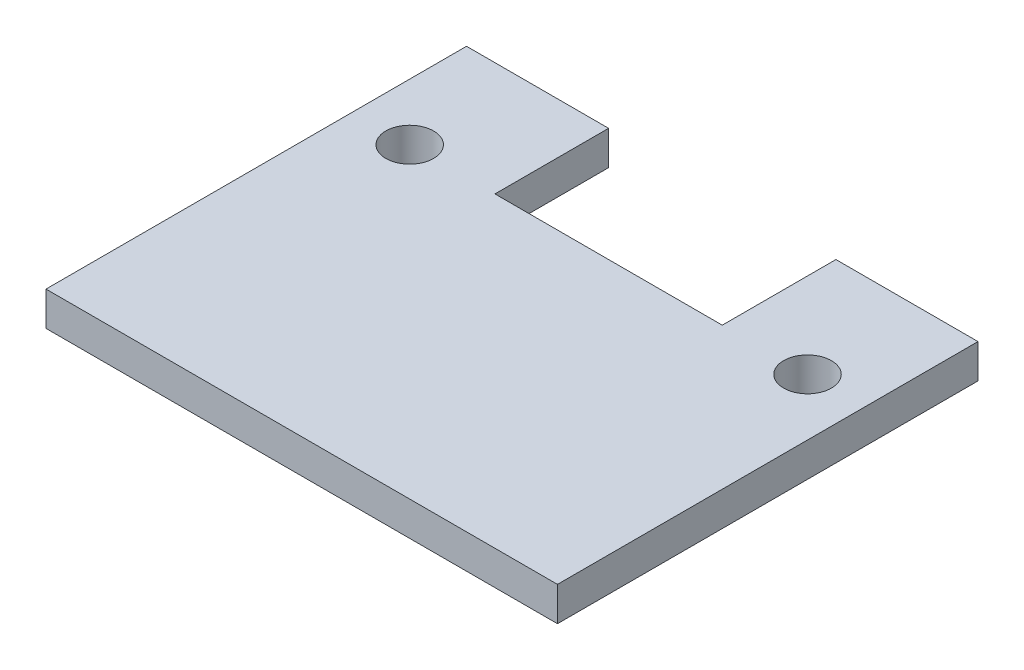
ISO-10303-21;
HEADER;
FILE_DESCRIPTION(('STEP AP214'),'2;1');
FILE_NAME('part.step','',(''),(''),'','','');
FILE_SCHEMA(('AUTOMOTIVE_DESIGN { 1 0 10303 214 1 1 1 1 }'));
ENDSEC;
DATA;
#1=APPLICATION_CONTEXT('core data for automotive mechanical design processes');
#2=APPLICATION_PROTOCOL_DEFINITION('international standard','automotive_design',2000,#1);
#3=PRODUCT_CONTEXT('',#1,'mechanical');
#4=PRODUCT('Part','Part','',(#3));
#5=PRODUCT_RELATED_PRODUCT_CATEGORY('part','',(#4));
#6=PRODUCT_DEFINITION_FORMATION('','',#4);
#7=PRODUCT_DEFINITION_CONTEXT('part definition',#1,'design');
#8=PRODUCT_DEFINITION('design','',#6,#7);
#9=PRODUCT_DEFINITION_SHAPE('','',#8);
#10=(LENGTH_UNIT() NAMED_UNIT(*) SI_UNIT(.MILLI.,.METRE.));
#11=(NAMED_UNIT(*) PLANE_ANGLE_UNIT() SI_UNIT($,.RADIAN.));
#12=(NAMED_UNIT(*) SI_UNIT($,.STERADIAN.) SOLID_ANGLE_UNIT());
#13=UNCERTAINTY_MEASURE_WITH_UNIT(LENGTH_MEASURE(1.E-05),#10,'distance_accuracy_value','');
#14=(GEOMETRIC_REPRESENTATION_CONTEXT(3) GLOBAL_UNCERTAINTY_ASSIGNED_CONTEXT((#13)) GLOBAL_UNIT_ASSIGNED_CONTEXT((#10,
#11,#12)) REPRESENTATION_CONTEXT('',''));
#15=CARTESIAN_POINT('',(0.,0.,0.));
#16=DIRECTION('',(0.,0.,1.));
#17=DIRECTION('',(1.,0.,0.));
#18=AXIS2_PLACEMENT_3D('',#15,#16,#17);
#19=CARTESIAN_POINT('',(0.,3.,-18.5));
#20=DIRECTION('',(0.,0.,-1.));
#21=DIRECTION('',(-1.,0.,0.));
#22=AXIS2_PLACEMENT_3D('',#19,#20,#21);
#23=PLANE('',#22);
#24=DIRECTION('',(1.,0.,0.));
#25=VECTOR('',#24,1.);
#26=CARTESIAN_POINT('',(0.,0.,-18.5));
#27=LINE('',#26,#25);
#28=CARTESIAN_POINT('',(10.,0.,-18.5));
#29=VERTEX_POINT('',#28);
#30=CARTESIAN_POINT('',(22.5,0.,-18.5));
#31=VERTEX_POINT('',#30);
#32=EDGE_CURVE('E142',#29,#31,#27,.T.);
#33=ORIENTED_EDGE('',*,*,#32,.F.);
#34=DIRECTION('',(0.,-1.,0.));
#35=VECTOR('',#34,1.);
#36=CARTESIAN_POINT('',(10.,3.,-18.5));
#37=LINE('',#36,#35);
#38=CARTESIAN_POINT('',(10.,3.,-18.5));
#39=VERTEX_POINT('',#38);
#40=EDGE_CURVE('E11',#39,#29,#37,.T.);
#41=ORIENTED_EDGE('',*,*,#40,.F.);
#42=DIRECTION('',(1.,0.,0.));
#43=VECTOR('',#42,1.);
#44=CARTESIAN_POINT('',(0.,3.,-18.5));
#45=LINE('',#44,#43);
#46=CARTESIAN_POINT('',(22.5,3.,-18.5));
#47=VERTEX_POINT('',#46);
#48=EDGE_CURVE('E131',#39,#47,#45,.T.);
#49=ORIENTED_EDGE('',*,*,#48,.T.);
#50=DIRECTION('',(0.,-1.,0.));
#51=VECTOR('',#50,1.);
#52=CARTESIAN_POINT('',(22.5,3.,-18.5));
#53=LINE('',#52,#51);
#54=EDGE_CURVE('E87',#47,#31,#53,.T.);
#55=ORIENTED_EDGE('',*,*,#54,.T.);
#56=EDGE_LOOP('',(#33,#41,#49,#55));
#57=FACE_BOUND('',#56,.T.);
#58=ADVANCED_FACE('F35',(#57),#23,.T.);
#59=CARTESIAN_POINT('',(10.,3.,0.));
#60=DIRECTION('',(1.,0.,0.));
#61=DIRECTION('',(0.,0.,-1.));
#62=AXIS2_PLACEMENT_3D('',#59,#60,#61);
#63=PLANE('',#62);
#64=DIRECTION('',(0.,0.,1.));
#65=VECTOR('',#64,1.);
#66=CARTESIAN_POINT('',(10.,0.,0.));
#67=LINE('',#66,#65);
#68=CARTESIAN_POINT('',(10.,0.,-8.5));
#69=VERTEX_POINT('',#68);
#70=EDGE_CURVE('E144',#29,#69,#67,.T.);
#71=ORIENTED_EDGE('',*,*,#70,.T.);
#72=DIRECTION('',(0.,-1.,0.));
#73=VECTOR('',#72,1.);
#74=CARTESIAN_POINT('',(10.,3.,-8.5));
#75=LINE('',#74,#73);
#76=CARTESIAN_POINT('',(10.,3.,-8.5));
#77=VERTEX_POINT('',#76);
#78=EDGE_CURVE('E44',#77,#69,#75,.T.);
#79=ORIENTED_EDGE('',*,*,#78,.F.);
#80=DIRECTION('',(0.,0.,1.));
#81=VECTOR('',#80,1.);
#82=CARTESIAN_POINT('',(10.,3.,0.));
#83=LINE('',#82,#81);
#84=EDGE_CURVE('E182',#39,#77,#83,.T.);
#85=ORIENTED_EDGE('',*,*,#84,.F.);
#86=ORIENTED_EDGE('',*,*,#40,.T.);
#87=EDGE_LOOP('',(#71,#79,#85,#86));
#88=FACE_BOUND('',#87,.T.);
#89=ADVANCED_FACE('F174',(#88),#63,.F.);
#90=CARTESIAN_POINT('',(0.,3.,-8.5));
#91=DIRECTION('',(0.,0.,-1.));
#92=DIRECTION('',(-1.,0.,0.));
#93=AXIS2_PLACEMENT_3D('',#90,#91,#92);
#94=PLANE('',#93);
#95=DIRECTION('',(1.,0.,0.));
#96=VECTOR('',#95,1.);
#97=CARTESIAN_POINT('',(0.,0.,-8.5));
#98=LINE('',#97,#96);
#99=CARTESIAN_POINT('',(-9.99999999999999,0.,-8.5));
#100=VERTEX_POINT('',#99);
#101=EDGE_CURVE('E148',#100,#69,#98,.T.);
#102=ORIENTED_EDGE('',*,*,#101,.F.);
#103=DIRECTION('',(0.,-1.,0.));
#104=VECTOR('',#103,1.);
#105=CARTESIAN_POINT('',(-9.99999999999999,3.,-8.5));
#106=LINE('',#105,#104);
#107=CARTESIAN_POINT('',(-9.99999999999999,3.,-8.5));
#108=VERTEX_POINT('',#107);
#109=EDGE_CURVE('E164',#108,#100,#106,.T.);
#110=ORIENTED_EDGE('',*,*,#109,.F.);
#111=DIRECTION('',(1.,0.,0.));
#112=VECTOR('',#111,1.);
#113=CARTESIAN_POINT('',(0.,3.,-8.5));
#114=LINE('',#113,#112);
#115=EDGE_CURVE('E171',#108,#77,#114,.T.);
#116=ORIENTED_EDGE('',*,*,#115,.T.);
#117=ORIENTED_EDGE('',*,*,#78,.T.);
#118=EDGE_LOOP('',(#102,#110,#116,#117));
#119=FACE_BOUND('',#118,.T.);
#120=ADVANCED_FACE('F169',(#119),#94,.T.);
#121=CARTESIAN_POINT('',(-9.99999999999999,3.,0.));
#122=DIRECTION('',(1.,0.,0.));
#123=DIRECTION('',(0.,0.,-1.));
#124=AXIS2_PLACEMENT_3D('',#121,#122,#123);
#125=PLANE('',#124);
#126=DIRECTION('',(0.,0.,1.));
#127=VECTOR('',#126,1.);
#128=CARTESIAN_POINT('',(-9.99999999999999,0.,0.));
#129=LINE('',#128,#127);
#130=CARTESIAN_POINT('',(-10.,0.,-18.5));
#131=VERTEX_POINT('',#130);
#132=EDGE_CURVE('E151',#131,#100,#129,.T.);
#133=ORIENTED_EDGE('',*,*,#132,.F.);
#134=DIRECTION('',(0.,-1.,0.));
#135=VECTOR('',#134,1.);
#136=CARTESIAN_POINT('',(-10.,3.,-18.5));
#137=LINE('',#136,#135);
#138=CARTESIAN_POINT('',(-10.,3.,-18.5));
#139=VERTEX_POINT('',#138);
#140=EDGE_CURVE('E162',#139,#131,#137,.T.);
#141=ORIENTED_EDGE('',*,*,#140,.F.);
#142=DIRECTION('',(0.,0.,1.));
#143=VECTOR('',#142,1.);
#144=CARTESIAN_POINT('',(-9.99999999999999,3.,0.));
#145=LINE('',#144,#143);
#146=EDGE_CURVE('E129',#139,#108,#145,.T.);
#147=ORIENTED_EDGE('',*,*,#146,.T.);
#148=ORIENTED_EDGE('',*,*,#109,.T.);
#149=EDGE_LOOP('',(#133,#141,#147,#148));
#150=FACE_BOUND('',#149,.T.);
#151=ADVANCED_FACE('F180',(#150),#125,.T.);
#152=CARTESIAN_POINT('',(-22.5,0.,-18.5));
#153=VERTEX_POINT('',#152);
#154=EDGE_CURVE('E145',#153,#131,#27,.T.);
#155=ORIENTED_EDGE('',*,*,#154,.F.);
#156=DIRECTION('',(0.,-1.,0.));
#157=VECTOR('',#156,1.);
#158=CARTESIAN_POINT('',(-22.5,3.,-18.5));
#159=LINE('',#158,#157);
#160=CARTESIAN_POINT('',(-22.5,3.,-18.5));
#161=VERTEX_POINT('',#160);
#162=EDGE_CURVE('E116',#161,#153,#159,.T.);
#163=ORIENTED_EDGE('',*,*,#162,.F.);
#164=EDGE_CURVE('E127',#161,#139,#45,.T.);
#165=ORIENTED_EDGE('',*,*,#164,.T.);
#166=ORIENTED_EDGE('',*,*,#140,.T.);
#167=EDGE_LOOP('',(#155,#163,#165,#166));
#168=FACE_BOUND('',#167,.T.);
#169=ADVANCED_FACE('F212',(#168),#23,.T.);
#170=CARTESIAN_POINT('',(-22.5,3.,0.));
#171=DIRECTION('',(-1.,0.,0.));
#172=DIRECTION('',(0.,0.,1.));
#173=AXIS2_PLACEMENT_3D('',#170,#171,#172);
#174=PLANE('',#173);
#175=DIRECTION('',(0.,0.,-1.));
#176=VECTOR('',#175,1.);
#177=CARTESIAN_POINT('',(-22.5,0.,0.));
#178=LINE('',#177,#176);
#179=CARTESIAN_POINT('',(-22.5,0.,18.5));
#180=VERTEX_POINT('',#179);
#181=EDGE_CURVE('E113',#180,#153,#178,.T.);
#182=ORIENTED_EDGE('',*,*,#181,.F.);
#183=DIRECTION('',(0.,-1.,0.));
#184=VECTOR('',#183,1.);
#185=CARTESIAN_POINT('',(-22.5,3.,18.5));
#186=LINE('',#185,#184);
#187=CARTESIAN_POINT('',(-22.5,3.,18.5));
#188=VERTEX_POINT('',#187);
#189=EDGE_CURVE('E107',#188,#180,#186,.T.);
#190=ORIENTED_EDGE('',*,*,#189,.F.);
#191=DIRECTION('',(0.,0.,-1.));
#192=VECTOR('',#191,1.);
#193=CARTESIAN_POINT('',(-22.5,3.,0.));
#194=LINE('',#193,#192);
#195=EDGE_CURVE('E111',#188,#161,#194,.T.);
#196=ORIENTED_EDGE('',*,*,#195,.T.);
#197=ORIENTED_EDGE('',*,*,#162,.T.);
#198=EDGE_LOOP('',(#182,#190,#196,#197));
#199=FACE_BOUND('',#198,.T.);
#200=ADVANCED_FACE('F109',(#199),#174,.T.);
#201=CARTESIAN_POINT('',(0.,3.,18.5));
#202=DIRECTION('',(0.,0.,-1.));
#203=DIRECTION('',(-1.,0.,0.));
#204=AXIS2_PLACEMENT_3D('',#201,#202,#203);
#205=PLANE('',#204);
#206=DIRECTION('',(1.,0.,0.));
#207=VECTOR('',#206,1.);
#208=CARTESIAN_POINT('',(0.,0.,18.5));
#209=LINE('',#208,#207);
#210=CARTESIAN_POINT('',(22.5,0.,18.5));
#211=VERTEX_POINT('',#210);
#212=EDGE_CURVE('E155',#180,#211,#209,.T.);
#213=ORIENTED_EDGE('',*,*,#212,.T.);
#214=DIRECTION('',(0.,-1.,0.));
#215=VECTOR('',#214,1.);
#216=CARTESIAN_POINT('',(22.5,3.,18.5));
#217=LINE('',#216,#215);
#218=CARTESIAN_POINT('',(22.5,3.,18.5));
#219=VERTEX_POINT('',#218);
#220=EDGE_CURVE('E117',#219,#211,#217,.T.);
#221=ORIENTED_EDGE('',*,*,#220,.F.);
#222=DIRECTION('',(1.,0.,0.));
#223=VECTOR('',#222,1.);
#224=CARTESIAN_POINT('',(0.,3.,18.5));
#225=LINE('',#224,#223);
#226=EDGE_CURVE('E120',#188,#219,#225,.T.);
#227=ORIENTED_EDGE('',*,*,#226,.F.);
#228=ORIENTED_EDGE('',*,*,#189,.T.);
#229=EDGE_LOOP('',(#213,#221,#227,#228));
#230=FACE_BOUND('',#229,.T.);
#231=ADVANCED_FACE('F121',(#230),#205,.F.);
#232=CARTESIAN_POINT('',(-17.5,3.,-8.50000000000001));
#233=DIRECTION('',(0.,-1.,0.));
#234=DIRECTION('',(0.,0.,-1.));
#235=AXIS2_PLACEMENT_3D('',#232,#233,#234);
#236=CYLINDRICAL_SURFACE('',#235,2.1);
#237=CARTESIAN_POINT('',(-17.5,3.,-8.50000000000001));
#238=DIRECTION('',(0.,1.,0.));
#239=DIRECTION('',(0.,0.,1.));
#240=AXIS2_PLACEMENT_3D('',#237,#238,#239);
#241=CIRCLE('',#240,2.1);
#242=CARTESIAN_POINT('',(-17.5,3.,-6.4));
#243=VERTEX_POINT('',#242);
#244=EDGE_CURVE('E185',#243,#243,#241,.T.);
#245=ORIENTED_EDGE('',*,*,#244,.T.);
#246=EDGE_LOOP('',(#245));
#247=FACE_BOUND('',#246,.T.);
#248=CARTESIAN_POINT('',(-17.5,0.,-8.50000000000001));
#249=DIRECTION('',(0.,1.,0.));
#250=DIRECTION('',(0.,0.,1.));
#251=AXIS2_PLACEMENT_3D('',#248,#249,#250);
#252=CIRCLE('',#251,2.1);
#253=CARTESIAN_POINT('',(-17.5,0.,-6.4));
#254=VERTEX_POINT('',#253);
#255=EDGE_CURVE('E139',#254,#254,#252,.T.);
#256=ORIENTED_EDGE('',*,*,#255,.F.);
#257=EDGE_LOOP('',(#256));
#258=FACE_BOUND('',#257,.T.);
#259=ADVANCED_FACE('F199',(#247,#258),#236,.F.);
#260=CARTESIAN_POINT('',(17.5,3.,-8.5));
#261=DIRECTION('',(0.,-1.,0.));
#262=DIRECTION('',(0.,0.,-1.));
#263=AXIS2_PLACEMENT_3D('',#260,#261,#262);
#264=CYLINDRICAL_SURFACE('',#263,2.1);
#265=CARTESIAN_POINT('',(17.5,3.,-8.5));
#266=DIRECTION('',(0.,1.,0.));
#267=DIRECTION('',(0.,0.,1.));
#268=AXIS2_PLACEMENT_3D('',#265,#266,#267);
#269=CIRCLE('',#268,2.1);
#270=CARTESIAN_POINT('',(17.5,3.,-6.4));
#271=VERTEX_POINT('',#270);
#272=EDGE_CURVE('E158',#271,#271,#269,.T.);
#273=ORIENTED_EDGE('',*,*,#272,.T.);
#274=EDGE_LOOP('',(#273));
#275=FACE_BOUND('',#274,.T.);
#276=CARTESIAN_POINT('',(17.5,0.,-8.5));
#277=DIRECTION('',(0.,1.,0.));
#278=DIRECTION('',(0.,0.,1.));
#279=AXIS2_PLACEMENT_3D('',#276,#277,#278);
#280=CIRCLE('',#279,2.1);
#281=CARTESIAN_POINT('',(17.5,0.,-6.4));
#282=VERTEX_POINT('',#281);
#283=EDGE_CURVE('E136',#282,#282,#280,.T.);
#284=ORIENTED_EDGE('',*,*,#283,.F.);
#285=EDGE_LOOP('',(#284));
#286=FACE_BOUND('',#285,.T.);
#287=ADVANCED_FACE('F37',(#275,#286),#264,.F.);
#288=CARTESIAN_POINT('',(22.5,3.,0.));
#289=DIRECTION('',(-1.,0.,0.));
#290=DIRECTION('',(0.,0.,1.));
#291=AXIS2_PLACEMENT_3D('',#288,#289,#290);
#292=PLANE('',#291);
#293=DIRECTION('',(0.,0.,-1.));
#294=VECTOR('',#293,1.);
#295=CARTESIAN_POINT('',(22.5,0.,0.));
#296=LINE('',#295,#294);
#297=EDGE_CURVE('E80',#211,#31,#296,.T.);
#298=ORIENTED_EDGE('',*,*,#297,.T.);
#299=ORIENTED_EDGE('',*,*,#54,.F.);
#300=DIRECTION('',(0.,0.,-1.));
#301=VECTOR('',#300,1.);
#302=CARTESIAN_POINT('',(22.5,3.,0.));
#303=LINE('',#302,#301);
#304=EDGE_CURVE('E52',#219,#47,#303,.T.);
#305=ORIENTED_EDGE('',*,*,#304,.F.);
#306=ORIENTED_EDGE('',*,*,#220,.T.);
#307=EDGE_LOOP('',(#298,#299,#305,#306));
#308=FACE_BOUND('',#307,.T.);
#309=ADVANCED_FACE('F195',(#308),#292,.F.);
#310=CARTESIAN_POINT('',(0.,3.,0.));
#311=DIRECTION('',(0.,1.,0.));
#312=DIRECTION('',(0.,0.,1.));
#313=AXIS2_PLACEMENT_3D('',#310,#311,#312);
#314=PLANE('',#313);
#315=ORIENTED_EDGE('',*,*,#272,.F.);
#316=EDGE_LOOP('',(#315));
#317=FACE_BOUND('',#316,.T.);
#318=ORIENTED_EDGE('',*,*,#244,.F.);
#319=EDGE_LOOP('',(#318));
#320=FACE_BOUND('',#319,.T.);
#321=ORIENTED_EDGE('',*,*,#48,.F.);
#322=ORIENTED_EDGE('',*,*,#84,.T.);
#323=ORIENTED_EDGE('',*,*,#115,.F.);
#324=ORIENTED_EDGE('',*,*,#146,.F.);
#325=ORIENTED_EDGE('',*,*,#164,.F.);
#326=ORIENTED_EDGE('',*,*,#195,.F.);
#327=ORIENTED_EDGE('',*,*,#226,.T.);
#328=ORIENTED_EDGE('',*,*,#304,.T.);
#329=EDGE_LOOP('',(#321,#322,#323,#324,#325,#326,#327,#328));
#330=FACE_BOUND('',#329,.T.);
#331=ADVANCED_FACE('F124',(#317,#320,#330),#314,.T.);
#332=CARTESIAN_POINT('',(0.,0.,0.));
#333=DIRECTION('',(0.,1.,0.));
#334=DIRECTION('',(0.,0.,1.));
#335=AXIS2_PLACEMENT_3D('',#332,#333,#334);
#336=PLANE('',#335);
#337=ORIENTED_EDGE('',*,*,#283,.T.);
#338=EDGE_LOOP('',(#337));
#339=FACE_BOUND('',#338,.T.);
#340=ORIENTED_EDGE('',*,*,#255,.T.);
#341=EDGE_LOOP('',(#340));
#342=FACE_BOUND('',#341,.T.);
#343=ORIENTED_EDGE('',*,*,#32,.T.);
#344=ORIENTED_EDGE('',*,*,#297,.F.);
#345=ORIENTED_EDGE('',*,*,#212,.F.);
#346=ORIENTED_EDGE('',*,*,#181,.T.);
#347=ORIENTED_EDGE('',*,*,#154,.T.);
#348=ORIENTED_EDGE('',*,*,#132,.T.);
#349=ORIENTED_EDGE('',*,*,#101,.T.);
#350=ORIENTED_EDGE('',*,*,#70,.F.);
#351=EDGE_LOOP('',(#343,#344,#345,#346,#347,#348,#349,#350));
#352=FACE_BOUND('',#351,.T.);
#353=ADVANCED_FACE('F175',(#339,#342,#352),#336,.F.);
#354=CLOSED_SHELL('',(#58,#89,#120,#151,#169,#200,#231,#259,#287,#309,#331,#353));
#355=MANIFOLD_SOLID_BREP('B2',#354);
#356=ADVANCED_BREP_SHAPE_REPRESENTATION('',(#18,#355),#14);
#357=SHAPE_DEFINITION_REPRESENTATION(#9,#356);
ENDSEC;
END-ISO-10303-21;
